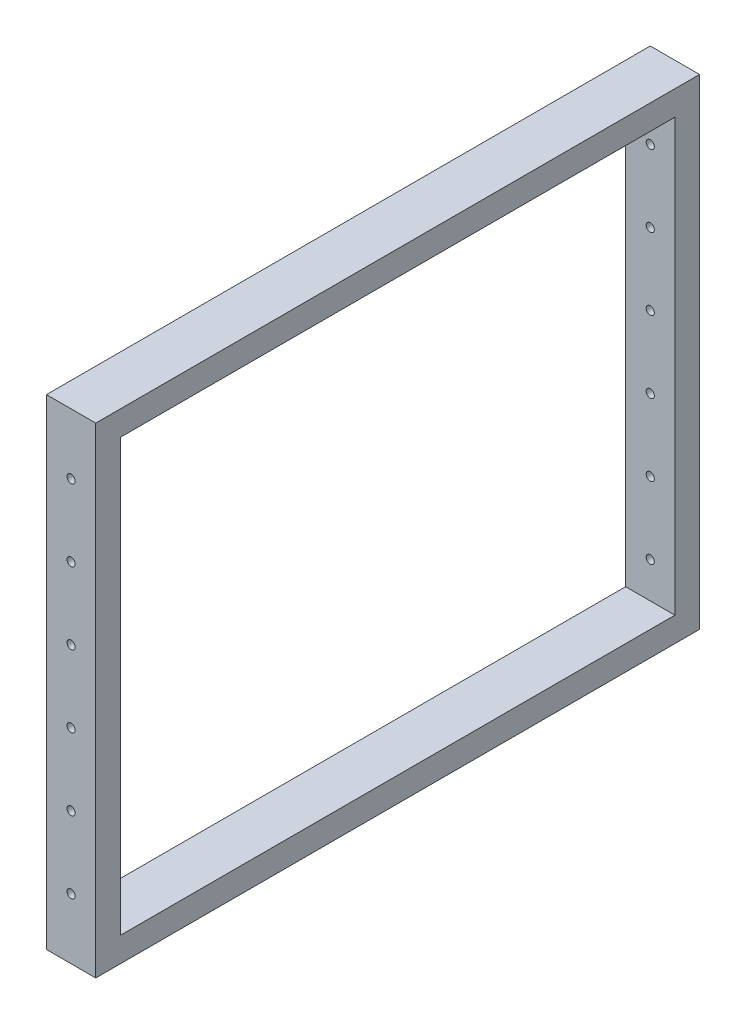
ISO-10303-21;
HEADER;
FILE_DESCRIPTION(('STEP AP214'),'2;1');
FILE_NAME('part.step','',(''),(''),'','','');
FILE_SCHEMA(('AUTOMOTIVE_DESIGN { 1 0 10303 214 1 1 1 1 }'));
ENDSEC;
DATA;
#1=APPLICATION_CONTEXT('core data for automotive mechanical design processes');
#2=APPLICATION_PROTOCOL_DEFINITION('international standard','automotive_design',2000,#1);
#3=PRODUCT_CONTEXT('',#1,'mechanical');
#4=PRODUCT('Part','Part','',(#3));
#5=PRODUCT_RELATED_PRODUCT_CATEGORY('part','',(#4));
#6=PRODUCT_DEFINITION_FORMATION('','',#4);
#7=PRODUCT_DEFINITION_CONTEXT('part definition',#1,'design');
#8=PRODUCT_DEFINITION('design','',#6,#7);
#9=PRODUCT_DEFINITION_SHAPE('','',#8);
#10=(LENGTH_UNIT() NAMED_UNIT(*) SI_UNIT(.MILLI.,.METRE.));
#11=(NAMED_UNIT(*) PLANE_ANGLE_UNIT() SI_UNIT($,.RADIAN.));
#12=(NAMED_UNIT(*) SI_UNIT($,.STERADIAN.) SOLID_ANGLE_UNIT());
#13=UNCERTAINTY_MEASURE_WITH_UNIT(LENGTH_MEASURE(1.E-05),#10,'distance_accuracy_value','');
#14=(GEOMETRIC_REPRESENTATION_CONTEXT(3) GLOBAL_UNCERTAINTY_ASSIGNED_CONTEXT((#13)) GLOBAL_UNIT_ASSIGNED_CONTEXT((#10,
#11,#12)) REPRESENTATION_CONTEXT('',''));
#15=CARTESIAN_POINT('',(0.,0.,0.));
#16=DIRECTION('',(0.,0.,1.));
#17=DIRECTION('',(1.,0.,0.));
#18=AXIS2_PLACEMENT_3D('',#15,#16,#17);
#19=CARTESIAN_POINT('',(40.,0.,0.));
#20=DIRECTION('',(1.,0.,0.));
#21=DIRECTION('',(0.,0.,-1.));
#22=AXIS2_PLACEMENT_3D('',#19,#20,#21);
#23=PLANE('',#22);
#24=DIRECTION('',(0.,-1.,0.));
#25=VECTOR('',#24,1.);
#26=CARTESIAN_POINT('',(40.,0.,490.));
#27=LINE('',#26,#25);
#28=CARTESIAN_POINT('',(40.,390.,490.));
#29=VERTEX_POINT('',#28);
#30=CARTESIAN_POINT('',(40.,0.,490.));
#31=VERTEX_POINT('',#30);
#32=EDGE_CURVE('E131',#29,#31,#27,.T.);
#33=ORIENTED_EDGE('',*,*,#32,.T.);
#34=DIRECTION('',(0.,0.,-1.));
#35=VECTOR('',#34,1.);
#36=CARTESIAN_POINT('',(40.,0.,0.));
#37=LINE('',#36,#35);
#38=CARTESIAN_POINT('',(40.,0.,0.));
#39=VERTEX_POINT('',#38);
#40=EDGE_CURVE('E134',#31,#39,#37,.T.);
#41=ORIENTED_EDGE('',*,*,#40,.T.);
#42=DIRECTION('',(0.,1.,0.));
#43=VECTOR('',#42,1.);
#44=CARTESIAN_POINT('',(40.,0.,0.));
#45=LINE('',#44,#43);
#46=CARTESIAN_POINT('',(40.,390.,0.));
#47=VERTEX_POINT('',#46);
#48=EDGE_CURVE('E137',#39,#47,#45,.T.);
#49=ORIENTED_EDGE('',*,*,#48,.T.);
#50=DIRECTION('',(0.,0.,1.));
#51=VECTOR('',#50,1.);
#52=CARTESIAN_POINT('',(40.,390.,0.));
#53=LINE('',#52,#51);
#54=EDGE_CURVE('E139',#47,#29,#53,.T.);
#55=ORIENTED_EDGE('',*,*,#54,.T.);
#56=EDGE_LOOP('',(#33,#41,#49,#55));
#57=FACE_BOUND('',#56,.T.);
#58=DIRECTION('',(0.,0.,1.));
#59=VECTOR('',#58,1.);
#60=CARTESIAN_POINT('',(40.,20.,0.));
#61=LINE('',#60,#59);
#62=CARTESIAN_POINT('',(40.,20.,20.));
#63=VERTEX_POINT('',#62);
#64=CARTESIAN_POINT('',(40.,20.,470.));
#65=VERTEX_POINT('',#64);
#66=EDGE_CURVE('E122',#63,#65,#61,.T.);
#67=ORIENTED_EDGE('',*,*,#66,.T.);
#68=DIRECTION('',(0.,1.,0.));
#69=VECTOR('',#68,1.);
#70=CARTESIAN_POINT('',(40.,0.,470.));
#71=LINE('',#70,#69);
#72=CARTESIAN_POINT('',(40.,370.,470.));
#73=VERTEX_POINT('',#72);
#74=EDGE_CURVE('E115',#65,#73,#71,.T.);
#75=ORIENTED_EDGE('',*,*,#74,.T.);
#76=DIRECTION('',(0.,0.,-1.));
#77=VECTOR('',#76,1.);
#78=CARTESIAN_POINT('',(40.,370.,0.));
#79=LINE('',#78,#77);
#80=CARTESIAN_POINT('',(40.,370.,20.));
#81=VERTEX_POINT('',#80);
#82=EDGE_CURVE('E104',#73,#81,#79,.T.);
#83=ORIENTED_EDGE('',*,*,#82,.T.);
#84=DIRECTION('',(0.,-1.,0.));
#85=VECTOR('',#84,1.);
#86=CARTESIAN_POINT('',(40.,0.,20.));
#87=LINE('',#86,#85);
#88=EDGE_CURVE('E109',#81,#63,#87,.T.);
#89=ORIENTED_EDGE('',*,*,#88,.T.);
#90=EDGE_LOOP('',(#67,#75,#83,#89));
#91=FACE_BOUND('',#90,.T.);
#92=ADVANCED_FACE('F41',(#57,#91),#23,.T.);
#93=CARTESIAN_POINT('',(0.,0.,0.));
#94=DIRECTION('',(1.,0.,0.));
#95=DIRECTION('',(0.,0.,-1.));
#96=AXIS2_PLACEMENT_3D('',#93,#94,#95);
#97=PLANE('',#96);
#98=DIRECTION('',(0.,-1.,0.));
#99=VECTOR('',#98,1.);
#100=CARTESIAN_POINT('',(0.,0.,490.));
#101=LINE('',#100,#99);
#102=CARTESIAN_POINT('',(0.,390.,490.));
#103=VERTEX_POINT('',#102);
#104=CARTESIAN_POINT('',(0.,0.,490.));
#105=VERTEX_POINT('',#104);
#106=EDGE_CURVE('E123',#103,#105,#101,.T.);
#107=ORIENTED_EDGE('',*,*,#106,.F.);
#108=DIRECTION('',(0.,0.,1.));
#109=VECTOR('',#108,1.);
#110=CARTESIAN_POINT('',(0.,390.,0.));
#111=LINE('',#110,#109);
#112=CARTESIAN_POINT('',(0.,390.,0.));
#113=VERTEX_POINT('',#112);
#114=EDGE_CURVE('E135',#113,#103,#111,.T.);
#115=ORIENTED_EDGE('',*,*,#114,.F.);
#116=DIRECTION('',(0.,1.,0.));
#117=VECTOR('',#116,1.);
#118=CARTESIAN_POINT('',(0.,0.,0.));
#119=LINE('',#118,#117);
#120=CARTESIAN_POINT('',(0.,0.,0.));
#121=VERTEX_POINT('',#120);
#122=EDGE_CURVE('E143',#121,#113,#119,.T.);
#123=ORIENTED_EDGE('',*,*,#122,.F.);
#124=DIRECTION('',(0.,0.,-1.));
#125=VECTOR('',#124,1.);
#126=CARTESIAN_POINT('',(0.,0.,0.));
#127=LINE('',#126,#125);
#128=EDGE_CURVE('E126',#105,#121,#127,.T.);
#129=ORIENTED_EDGE('',*,*,#128,.F.);
#130=EDGE_LOOP('',(#107,#115,#123,#129));
#131=FACE_BOUND('',#130,.T.);
#132=DIRECTION('',(0.,1.,0.));
#133=VECTOR('',#132,1.);
#134=CARTESIAN_POINT('',(0.,0.,470.));
#135=LINE('',#134,#133);
#136=CARTESIAN_POINT('',(0.,20.,470.));
#137=VERTEX_POINT('',#136);
#138=CARTESIAN_POINT('',(0.,370.,470.));
#139=VERTEX_POINT('',#138);
#140=EDGE_CURVE('E11',#137,#139,#135,.T.);
#141=ORIENTED_EDGE('',*,*,#140,.F.);
#142=DIRECTION('',(0.,0.,1.));
#143=VECTOR('',#142,1.);
#144=CARTESIAN_POINT('',(0.,20.,0.));
#145=LINE('',#144,#143);
#146=CARTESIAN_POINT('',(0.,20.,20.));
#147=VERTEX_POINT('',#146);
#148=EDGE_CURVE('E50',#147,#137,#145,.T.);
#149=ORIENTED_EDGE('',*,*,#148,.F.);
#150=DIRECTION('',(0.,-1.,0.));
#151=VECTOR('',#150,1.);
#152=CARTESIAN_POINT('',(0.,0.,20.));
#153=LINE('',#152,#151);
#154=CARTESIAN_POINT('',(0.,370.,20.));
#155=VERTEX_POINT('',#154);
#156=EDGE_CURVE('E159',#155,#147,#153,.T.);
#157=ORIENTED_EDGE('',*,*,#156,.F.);
#158=DIRECTION('',(0.,0.,-1.));
#159=VECTOR('',#158,1.);
#160=CARTESIAN_POINT('',(0.,370.,0.));
#161=LINE('',#160,#159);
#162=EDGE_CURVE('E157',#139,#155,#161,.T.);
#163=ORIENTED_EDGE('',*,*,#162,.F.);
#164=EDGE_LOOP('',(#141,#149,#157,#163));
#165=FACE_BOUND('',#164,.T.);
#166=ADVANCED_FACE('F244',(#131,#165),#97,.F.);
#167=CARTESIAN_POINT('',(40.,0.,490.));
#168=DIRECTION('',(0.,0.,-1.));
#169=DIRECTION('',(-1.,0.,0.));
#170=AXIS2_PLACEMENT_3D('',#167,#168,#169);
#171=PLANE('',#170);
#172=CARTESIAN_POINT('',(20.,340.833333333333,490.));
#173=DIRECTION('',(0.,0.,-1.));
#174=DIRECTION('',(-1.,0.,0.));
#175=AXIS2_PLACEMENT_3D('',#172,#173,#174);
#176=CIRCLE('',#175,3.3);
#177=CARTESIAN_POINT('',(16.7,340.833333333333,490.));
#178=VERTEX_POINT('',#177);
#179=EDGE_CURVE('E184',#178,#178,#176,.F.);
#180=ORIENTED_EDGE('',*,*,#179,.F.);
#181=EDGE_LOOP('',(#180));
#182=FACE_BOUND('',#181,.T.);
#183=CARTESIAN_POINT('',(20.,282.5,490.));
#184=DIRECTION('',(0.,0.,-1.));
#185=DIRECTION('',(-1.,0.,0.));
#186=AXIS2_PLACEMENT_3D('',#183,#184,#185);
#187=CIRCLE('',#186,3.3);
#188=CARTESIAN_POINT('',(16.7,282.5,490.));
#189=VERTEX_POINT('',#188);
#190=EDGE_CURVE('E180',#189,#189,#187,.F.);
#191=ORIENTED_EDGE('',*,*,#190,.F.);
#192=EDGE_LOOP('',(#191));
#193=FACE_BOUND('',#192,.T.);
#194=CARTESIAN_POINT('',(20.,224.166666666667,490.));
#195=DIRECTION('',(0.,0.,-1.));
#196=DIRECTION('',(-1.,0.,0.));
#197=AXIS2_PLACEMENT_3D('',#194,#195,#196);
#198=CIRCLE('',#197,3.3);
#199=CARTESIAN_POINT('',(16.7,224.166666666667,490.));
#200=VERTEX_POINT('',#199);
#201=EDGE_CURVE('E176',#200,#200,#198,.F.);
#202=ORIENTED_EDGE('',*,*,#201,.F.);
#203=EDGE_LOOP('',(#202));
#204=FACE_BOUND('',#203,.T.);
#205=CARTESIAN_POINT('',(20.,165.833333333333,490.));
#206=DIRECTION('',(0.,0.,-1.));
#207=DIRECTION('',(-1.,0.,0.));
#208=AXIS2_PLACEMENT_3D('',#205,#206,#207);
#209=CIRCLE('',#208,3.3);
#210=CARTESIAN_POINT('',(16.7,165.833333333333,490.));
#211=VERTEX_POINT('',#210);
#212=EDGE_CURVE('E171',#211,#211,#209,.F.);
#213=ORIENTED_EDGE('',*,*,#212,.F.);
#214=EDGE_LOOP('',(#213));
#215=FACE_BOUND('',#214,.T.);
#216=CARTESIAN_POINT('',(20.,107.5,490.));
#217=DIRECTION('',(0.,0.,-1.));
#218=DIRECTION('',(-1.,0.,0.));
#219=AXIS2_PLACEMENT_3D('',#216,#217,#218);
#220=CIRCLE('',#219,3.3);
#221=CARTESIAN_POINT('',(16.7,107.5,490.));
#222=VERTEX_POINT('',#221);
#223=EDGE_CURVE('E166',#222,#222,#220,.F.);
#224=ORIENTED_EDGE('',*,*,#223,.F.);
#225=EDGE_LOOP('',(#224));
#226=FACE_BOUND('',#225,.T.);
#227=CARTESIAN_POINT('',(20.,49.1666666666667,490.));
#228=DIRECTION('',(0.,0.,-1.));
#229=DIRECTION('',(-1.,0.,0.));
#230=AXIS2_PLACEMENT_3D('',#227,#228,#229);
#231=CIRCLE('',#230,3.3);
#232=CARTESIAN_POINT('',(16.7,49.1666666666667,490.));
#233=VERTEX_POINT('',#232);
#234=EDGE_CURVE('E119',#233,#233,#231,.F.);
#235=ORIENTED_EDGE('',*,*,#234,.F.);
#236=EDGE_LOOP('',(#235));
#237=FACE_BOUND('',#236,.T.);
#238=ORIENTED_EDGE('',*,*,#106,.T.);
#239=DIRECTION('',(-1.,0.,0.));
#240=VECTOR('',#239,1.);
#241=CARTESIAN_POINT('',(40.,0.,490.));
#242=LINE('',#241,#240);
#243=EDGE_CURVE('E154',#31,#105,#242,.T.);
#244=ORIENTED_EDGE('',*,*,#243,.F.);
#245=ORIENTED_EDGE('',*,*,#32,.F.);
#246=DIRECTION('',(-1.,0.,0.));
#247=VECTOR('',#246,1.);
#248=CARTESIAN_POINT('',(40.,390.,490.));
#249=LINE('',#248,#247);
#250=EDGE_CURVE('E140',#29,#103,#249,.T.);
#251=ORIENTED_EDGE('',*,*,#250,.T.);
#252=EDGE_LOOP('',(#238,#244,#245,#251));
#253=FACE_BOUND('',#252,.T.);
#254=ADVANCED_FACE('F43',(#182,#193,#204,#215,#226,#237,#253),#171,.F.);
#255=CARTESIAN_POINT('',(40.,0.,0.));
#256=DIRECTION('',(0.,1.,0.));
#257=DIRECTION('',(0.,0.,1.));
#258=AXIS2_PLACEMENT_3D('',#255,#256,#257);
#259=PLANE('',#258);
#260=ORIENTED_EDGE('',*,*,#128,.T.);
#261=DIRECTION('',(-1.,0.,0.));
#262=VECTOR('',#261,1.);
#263=CARTESIAN_POINT('',(40.,0.,0.));
#264=LINE('',#263,#262);
#265=EDGE_CURVE('E151',#39,#121,#264,.T.);
#266=ORIENTED_EDGE('',*,*,#265,.F.);
#267=ORIENTED_EDGE('',*,*,#40,.F.);
#268=ORIENTED_EDGE('',*,*,#243,.T.);
#269=EDGE_LOOP('',(#260,#266,#267,#268));
#270=FACE_BOUND('',#269,.T.);
#271=ADVANCED_FACE('F252',(#270),#259,.F.);
#272=CARTESIAN_POINT('',(40.,0.,0.));
#273=DIRECTION('',(0.,0.,1.));
#274=DIRECTION('',(1.,0.,0.));
#275=AXIS2_PLACEMENT_3D('',#272,#273,#274);
#276=PLANE('',#275);
#277=CARTESIAN_POINT('',(20.,340.833333333333,0.));
#278=DIRECTION('',(0.,0.,1.));
#279=DIRECTION('',(1.,0.,0.));
#280=AXIS2_PLACEMENT_3D('',#277,#278,#279);
#281=CIRCLE('',#280,3.3);
#282=CARTESIAN_POINT('',(23.3,340.833333333333,0.));
#283=VERTEX_POINT('',#282);
#284=EDGE_CURVE('E191',#283,#283,#281,.F.);
#285=ORIENTED_EDGE('',*,*,#284,.F.);
#286=EDGE_LOOP('',(#285));
#287=FACE_BOUND('',#286,.T.);
#288=CARTESIAN_POINT('',(20.,282.5,0.));
#289=DIRECTION('',(0.,0.,1.));
#290=DIRECTION('',(1.,0.,0.));
#291=AXIS2_PLACEMENT_3D('',#288,#289,#290);
#292=CIRCLE('',#291,3.3);
#293=CARTESIAN_POINT('',(23.3,282.5,0.));
#294=VERTEX_POINT('',#293);
#295=EDGE_CURVE('E188',#294,#294,#292,.F.);
#296=ORIENTED_EDGE('',*,*,#295,.F.);
#297=EDGE_LOOP('',(#296));
#298=FACE_BOUND('',#297,.T.);
#299=CARTESIAN_POINT('',(20.,224.166666666667,0.));
#300=DIRECTION('',(0.,0.,1.));
#301=DIRECTION('',(1.,0.,0.));
#302=AXIS2_PLACEMENT_3D('',#299,#300,#301);
#303=CIRCLE('',#302,3.3);
#304=CARTESIAN_POINT('',(23.3,224.166666666667,0.));
#305=VERTEX_POINT('',#304);
#306=EDGE_CURVE('E206',#305,#305,#303,.F.);
#307=ORIENTED_EDGE('',*,*,#306,.F.);
#308=EDGE_LOOP('',(#307));
#309=FACE_BOUND('',#308,.T.);
#310=CARTESIAN_POINT('',(20.,165.833333333333,0.));
#311=DIRECTION('',(0.,0.,1.));
#312=DIRECTION('',(1.,0.,0.));
#313=AXIS2_PLACEMENT_3D('',#310,#311,#312);
#314=CIRCLE('',#313,3.3);
#315=CARTESIAN_POINT('',(23.3,165.833333333333,0.));
#316=VERTEX_POINT('',#315);
#317=EDGE_CURVE('E213',#316,#316,#314,.F.);
#318=ORIENTED_EDGE('',*,*,#317,.F.);
#319=EDGE_LOOP('',(#318));
#320=FACE_BOUND('',#319,.T.);
#321=CARTESIAN_POINT('',(20.,107.5,0.));
#322=DIRECTION('',(0.,0.,1.));
#323=DIRECTION('',(1.,0.,0.));
#324=AXIS2_PLACEMENT_3D('',#321,#322,#323);
#325=CIRCLE('',#324,3.3);
#326=CARTESIAN_POINT('',(23.3,107.5,0.));
#327=VERTEX_POINT('',#326);
#328=EDGE_CURVE('E220',#327,#327,#325,.F.);
#329=ORIENTED_EDGE('',*,*,#328,.F.);
#330=EDGE_LOOP('',(#329));
#331=FACE_BOUND('',#330,.T.);
#332=CARTESIAN_POINT('',(20.,49.1666666666667,0.));
#333=DIRECTION('',(0.,0.,1.));
#334=DIRECTION('',(1.,0.,0.));
#335=AXIS2_PLACEMENT_3D('',#332,#333,#334);
#336=CIRCLE('',#335,3.3);
#337=CARTESIAN_POINT('',(23.3,49.1666666666667,0.));
#338=VERTEX_POINT('',#337);
#339=EDGE_CURVE('E227',#338,#338,#336,.F.);
#340=ORIENTED_EDGE('',*,*,#339,.F.);
#341=EDGE_LOOP('',(#340));
#342=FACE_BOUND('',#341,.T.);
#343=ORIENTED_EDGE('',*,*,#122,.T.);
#344=DIRECTION('',(-1.,0.,0.));
#345=VECTOR('',#344,1.);
#346=CARTESIAN_POINT('',(40.,390.,0.));
#347=LINE('',#346,#345);
#348=EDGE_CURVE('E148',#47,#113,#347,.T.);
#349=ORIENTED_EDGE('',*,*,#348,.F.);
#350=ORIENTED_EDGE('',*,*,#48,.F.);
#351=ORIENTED_EDGE('',*,*,#265,.T.);
#352=EDGE_LOOP('',(#343,#349,#350,#351));
#353=FACE_BOUND('',#352,.T.);
#354=ADVANCED_FACE('F262',(#287,#298,#309,#320,#331,#342,#353),#276,.F.);
#355=CARTESIAN_POINT('',(40.,390.,0.));
#356=DIRECTION('',(0.,-1.,0.));
#357=DIRECTION('',(0.,0.,-1.));
#358=AXIS2_PLACEMENT_3D('',#355,#356,#357);
#359=PLANE('',#358);
#360=ORIENTED_EDGE('',*,*,#114,.T.);
#361=ORIENTED_EDGE('',*,*,#250,.F.);
#362=ORIENTED_EDGE('',*,*,#54,.F.);
#363=ORIENTED_EDGE('',*,*,#348,.T.);
#364=EDGE_LOOP('',(#360,#361,#362,#363));
#365=FACE_BOUND('',#364,.T.);
#366=ADVANCED_FACE('F259',(#365),#359,.F.);
#367=CARTESIAN_POINT('',(41.,20.,470.));
#368=DIRECTION('',(0.,0.,-1.));
#369=DIRECTION('',(-1.,0.,0.));
#370=AXIS2_PLACEMENT_3D('',#367,#368,#369);
#371=PLANE('',#370);
#372=CARTESIAN_POINT('',(20.,340.833333333333,470.));
#373=DIRECTION('',(0.,0.,-1.));
#374=DIRECTION('',(-1.,0.,0.));
#375=AXIS2_PLACEMENT_3D('',#372,#373,#374);
#376=CIRCLE('',#375,3.3);
#377=CARTESIAN_POINT('',(16.7,340.833333333333,470.));
#378=VERTEX_POINT('',#377);
#379=EDGE_CURVE('E196',#378,#378,#376,.F.);
#380=ORIENTED_EDGE('',*,*,#379,.T.);
#381=EDGE_LOOP('',(#380));
#382=FACE_BOUND('',#381,.T.);
#383=CARTESIAN_POINT('',(20.,282.5,470.));
#384=DIRECTION('',(0.,0.,-1.));
#385=DIRECTION('',(-1.,0.,0.));
#386=AXIS2_PLACEMENT_3D('',#383,#384,#385);
#387=CIRCLE('',#386,3.3);
#388=CARTESIAN_POINT('',(16.7,282.5,470.));
#389=VERTEX_POINT('',#388);
#390=EDGE_CURVE('E183',#389,#389,#387,.F.);
#391=ORIENTED_EDGE('',*,*,#390,.T.);
#392=EDGE_LOOP('',(#391));
#393=FACE_BOUND('',#392,.T.);
#394=CARTESIAN_POINT('',(20.,224.166666666667,470.));
#395=DIRECTION('',(0.,0.,-1.));
#396=DIRECTION('',(-1.,0.,0.));
#397=AXIS2_PLACEMENT_3D('',#394,#395,#396);
#398=CIRCLE('',#397,3.3);
#399=CARTESIAN_POINT('',(16.7,224.166666666667,470.));
#400=VERTEX_POINT('',#399);
#401=EDGE_CURVE('E179',#400,#400,#398,.F.);
#402=ORIENTED_EDGE('',*,*,#401,.T.);
#403=EDGE_LOOP('',(#402));
#404=FACE_BOUND('',#403,.T.);
#405=CARTESIAN_POINT('',(20.,165.833333333333,470.));
#406=DIRECTION('',(0.,0.,-1.));
#407=DIRECTION('',(-1.,0.,0.));
#408=AXIS2_PLACEMENT_3D('',#405,#406,#407);
#409=CIRCLE('',#408,3.3);
#410=CARTESIAN_POINT('',(16.7,165.833333333333,470.));
#411=VERTEX_POINT('',#410);
#412=EDGE_CURVE('E175',#411,#411,#409,.F.);
#413=ORIENTED_EDGE('',*,*,#412,.T.);
#414=EDGE_LOOP('',(#413));
#415=FACE_BOUND('',#414,.T.);
#416=CARTESIAN_POINT('',(20.,107.5,470.));
#417=DIRECTION('',(0.,0.,-1.));
#418=DIRECTION('',(-1.,0.,0.));
#419=AXIS2_PLACEMENT_3D('',#416,#417,#418);
#420=CIRCLE('',#419,3.3);
#421=CARTESIAN_POINT('',(16.7,107.5,470.));
#422=VERTEX_POINT('',#421);
#423=EDGE_CURVE('E170',#422,#422,#420,.F.);
#424=ORIENTED_EDGE('',*,*,#423,.T.);
#425=EDGE_LOOP('',(#424));
#426=FACE_BOUND('',#425,.T.);
#427=CARTESIAN_POINT('',(20.,49.1666666666667,470.));
#428=DIRECTION('',(0.,0.,-1.));
#429=DIRECTION('',(-1.,0.,0.));
#430=AXIS2_PLACEMENT_3D('',#427,#428,#429);
#431=CIRCLE('',#430,3.3);
#432=CARTESIAN_POINT('',(16.7,49.1666666666667,470.));
#433=VERTEX_POINT('',#432);
#434=EDGE_CURVE('E165',#433,#433,#431,.F.);
#435=ORIENTED_EDGE('',*,*,#434,.T.);
#436=EDGE_LOOP('',(#435));
#437=FACE_BOUND('',#436,.T.);
#438=DIRECTION('',(-1.,0.,0.));
#439=VECTOR('',#438,1.);
#440=CARTESIAN_POINT('',(41.,20.,470.));
#441=LINE('',#440,#439);
#442=EDGE_CURVE('E110',#65,#137,#441,.T.);
#443=ORIENTED_EDGE('',*,*,#442,.T.);
#444=ORIENTED_EDGE('',*,*,#140,.T.);
#445=DIRECTION('',(-1.,0.,0.));
#446=VECTOR('',#445,1.);
#447=CARTESIAN_POINT('',(41.,370.,470.));
#448=LINE('',#447,#446);
#449=EDGE_CURVE('E63',#73,#139,#448,.T.);
#450=ORIENTED_EDGE('',*,*,#449,.F.);
#451=ORIENTED_EDGE('',*,*,#74,.F.);
#452=EDGE_LOOP('',(#443,#444,#450,#451));
#453=FACE_BOUND('',#452,.T.);
#454=ADVANCED_FACE('F114',(#382,#393,#404,#415,#426,#437,#453),#371,.T.);
#455=CARTESIAN_POINT('',(41.,20.,20.));
#456=DIRECTION('',(0.,1.,0.));
#457=DIRECTION('',(0.,0.,1.));
#458=AXIS2_PLACEMENT_3D('',#455,#456,#457);
#459=PLANE('',#458);
#460=DIRECTION('',(-1.,0.,0.));
#461=VECTOR('',#460,1.);
#462=CARTESIAN_POINT('',(41.,20.,20.));
#463=LINE('',#462,#461);
#464=EDGE_CURVE('E233',#63,#147,#463,.T.);
#465=ORIENTED_EDGE('',*,*,#464,.T.);
#466=ORIENTED_EDGE('',*,*,#148,.T.);
#467=ORIENTED_EDGE('',*,*,#442,.F.);
#468=ORIENTED_EDGE('',*,*,#66,.F.);
#469=EDGE_LOOP('',(#465,#466,#467,#468));
#470=FACE_BOUND('',#469,.T.);
#471=ADVANCED_FACE('F242',(#470),#459,.T.);
#472=CARTESIAN_POINT('',(41.,20.,20.));
#473=DIRECTION('',(0.,0.,1.));
#474=DIRECTION('',(1.,0.,0.));
#475=AXIS2_PLACEMENT_3D('',#472,#473,#474);
#476=PLANE('',#475);
#477=CARTESIAN_POINT('',(20.,340.833333333333,20.));
#478=DIRECTION('',(0.,0.,1.));
#479=DIRECTION('',(1.,0.,0.));
#480=AXIS2_PLACEMENT_3D('',#477,#478,#479);
#481=CIRCLE('',#480,3.3);
#482=CARTESIAN_POINT('',(23.3,340.833333333333,20.));
#483=VERTEX_POINT('',#482);
#484=EDGE_CURVE('E45',#483,#483,#481,.F.);
#485=ORIENTED_EDGE('',*,*,#484,.T.);
#486=EDGE_LOOP('',(#485));
#487=FACE_BOUND('',#486,.T.);
#488=CARTESIAN_POINT('',(20.,282.5,20.));
#489=DIRECTION('',(0.,0.,1.));
#490=DIRECTION('',(1.,0.,0.));
#491=AXIS2_PLACEMENT_3D('',#488,#489,#490);
#492=CIRCLE('',#491,3.3);
#493=CARTESIAN_POINT('',(23.3,282.5,20.));
#494=VERTEX_POINT('',#493);
#495=EDGE_CURVE('E181',#494,#494,#492,.F.);
#496=ORIENTED_EDGE('',*,*,#495,.T.);
#497=EDGE_LOOP('',(#496));
#498=FACE_BOUND('',#497,.T.);
#499=CARTESIAN_POINT('',(20.,224.166666666667,20.));
#500=DIRECTION('',(0.,0.,1.));
#501=DIRECTION('',(1.,0.,0.));
#502=AXIS2_PLACEMENT_3D('',#499,#500,#501);
#503=CIRCLE('',#502,3.3);
#504=CARTESIAN_POINT('',(23.3,224.166666666667,20.));
#505=VERTEX_POINT('',#504);
#506=EDGE_CURVE('E177',#505,#505,#503,.F.);
#507=ORIENTED_EDGE('',*,*,#506,.T.);
#508=EDGE_LOOP('',(#507));
#509=FACE_BOUND('',#508,.T.);
#510=CARTESIAN_POINT('',(20.,165.833333333333,20.));
#511=DIRECTION('',(0.,0.,1.));
#512=DIRECTION('',(1.,0.,0.));
#513=AXIS2_PLACEMENT_3D('',#510,#511,#512);
#514=CIRCLE('',#513,3.3);
#515=CARTESIAN_POINT('',(23.3,165.833333333333,20.));
#516=VERTEX_POINT('',#515);
#517=EDGE_CURVE('E172',#516,#516,#514,.F.);
#518=ORIENTED_EDGE('',*,*,#517,.T.);
#519=EDGE_LOOP('',(#518));
#520=FACE_BOUND('',#519,.T.);
#521=CARTESIAN_POINT('',(20.,107.5,20.));
#522=DIRECTION('',(0.,0.,1.));
#523=DIRECTION('',(1.,0.,0.));
#524=AXIS2_PLACEMENT_3D('',#521,#522,#523);
#525=CIRCLE('',#524,3.3);
#526=CARTESIAN_POINT('',(23.3,107.5,20.));
#527=VERTEX_POINT('',#526);
#528=EDGE_CURVE('E167',#527,#527,#525,.F.);
#529=ORIENTED_EDGE('',*,*,#528,.T.);
#530=EDGE_LOOP('',(#529));
#531=FACE_BOUND('',#530,.T.);
#532=CARTESIAN_POINT('',(20.,49.1666666666667,20.));
#533=DIRECTION('',(0.,0.,1.));
#534=DIRECTION('',(1.,0.,0.));
#535=AXIS2_PLACEMENT_3D('',#532,#533,#534);
#536=CIRCLE('',#535,3.3);
#537=CARTESIAN_POINT('',(23.3,49.1666666666667,20.));
#538=VERTEX_POINT('',#537);
#539=EDGE_CURVE('E162',#538,#538,#536,.F.);
#540=ORIENTED_EDGE('',*,*,#539,.T.);
#541=EDGE_LOOP('',(#540));
#542=FACE_BOUND('',#541,.T.);
#543=DIRECTION('',(-1.,0.,0.));
#544=VECTOR('',#543,1.);
#545=CARTESIAN_POINT('',(41.,370.,20.));
#546=LINE('',#545,#544);
#547=EDGE_CURVE('E58',#81,#155,#546,.T.);
#548=ORIENTED_EDGE('',*,*,#547,.T.);
#549=ORIENTED_EDGE('',*,*,#156,.T.);
#550=ORIENTED_EDGE('',*,*,#464,.F.);
#551=ORIENTED_EDGE('',*,*,#88,.F.);
#552=EDGE_LOOP('',(#548,#549,#550,#551));
#553=FACE_BOUND('',#552,.T.);
#554=ADVANCED_FACE('F238',(#487,#498,#509,#520,#531,#542,#553),#476,.T.);
#555=CARTESIAN_POINT('',(41.,370.,20.));
#556=DIRECTION('',(0.,-1.,0.));
#557=DIRECTION('',(0.,0.,-1.));
#558=AXIS2_PLACEMENT_3D('',#555,#556,#557);
#559=PLANE('',#558);
#560=ORIENTED_EDGE('',*,*,#449,.T.);
#561=ORIENTED_EDGE('',*,*,#162,.T.);
#562=ORIENTED_EDGE('',*,*,#547,.F.);
#563=ORIENTED_EDGE('',*,*,#82,.F.);
#564=EDGE_LOOP('',(#560,#561,#562,#563));
#565=FACE_BOUND('',#564,.T.);
#566=ADVANCED_FACE('F105',(#565),#559,.T.);
#567=CARTESIAN_POINT('',(20.,49.1666666666667,491.));
#568=DIRECTION('',(0.,0.,-1.));
#569=DIRECTION('',(-1.,0.,0.));
#570=AXIS2_PLACEMENT_3D('',#567,#568,#569);
#571=CYLINDRICAL_SURFACE('',#570,3.3);
#572=ORIENTED_EDGE('',*,*,#539,.F.);
#573=EDGE_LOOP('',(#572));
#574=FACE_BOUND('',#573,.T.);
#575=ORIENTED_EDGE('',*,*,#339,.T.);
#576=EDGE_LOOP('',(#575));
#577=FACE_BOUND('',#576,.T.);
#578=ADVANCED_FACE('F304',(#574,#577),#571,.F.);
#579=ORIENTED_EDGE('',*,*,#434,.F.);
#580=EDGE_LOOP('',(#579));
#581=FACE_BOUND('',#580,.T.);
#582=ORIENTED_EDGE('',*,*,#234,.T.);
#583=EDGE_LOOP('',(#582));
#584=FACE_BOUND('',#583,.T.);
#585=ADVANCED_FACE('F310',(#581,#584),#571,.F.);
#586=CARTESIAN_POINT('',(20.,107.5,491.));
#587=DIRECTION('',(0.,0.,-1.));
#588=DIRECTION('',(-1.,0.,0.));
#589=AXIS2_PLACEMENT_3D('',#586,#587,#588);
#590=CYLINDRICAL_SURFACE('',#589,3.3);
#591=ORIENTED_EDGE('',*,*,#528,.F.);
#592=EDGE_LOOP('',(#591));
#593=FACE_BOUND('',#592,.T.);
#594=ORIENTED_EDGE('',*,*,#328,.T.);
#595=EDGE_LOOP('',(#594));
#596=FACE_BOUND('',#595,.T.);
#597=ADVANCED_FACE('F313',(#593,#596),#590,.F.);
#598=ORIENTED_EDGE('',*,*,#423,.F.);
#599=EDGE_LOOP('',(#598));
#600=FACE_BOUND('',#599,.T.);
#601=ORIENTED_EDGE('',*,*,#223,.T.);
#602=EDGE_LOOP('',(#601));
#603=FACE_BOUND('',#602,.T.);
#604=ADVANCED_FACE('F320',(#600,#603),#590,.F.);
#605=CARTESIAN_POINT('',(20.,165.833333333333,491.));
#606=DIRECTION('',(0.,0.,-1.));
#607=DIRECTION('',(-1.,0.,0.));
#608=AXIS2_PLACEMENT_3D('',#605,#606,#607);
#609=CYLINDRICAL_SURFACE('',#608,3.3);
#610=ORIENTED_EDGE('',*,*,#517,.F.);
#611=EDGE_LOOP('',(#610));
#612=FACE_BOUND('',#611,.T.);
#613=ORIENTED_EDGE('',*,*,#317,.T.);
#614=EDGE_LOOP('',(#613));
#615=FACE_BOUND('',#614,.T.);
#616=ADVANCED_FACE('F325',(#612,#615),#609,.F.);
#617=ORIENTED_EDGE('',*,*,#412,.F.);
#618=EDGE_LOOP('',(#617));
#619=FACE_BOUND('',#618,.T.);
#620=ORIENTED_EDGE('',*,*,#212,.T.);
#621=EDGE_LOOP('',(#620));
#622=FACE_BOUND('',#621,.T.);
#623=ADVANCED_FACE('F350',(#619,#622),#609,.F.);
#624=CARTESIAN_POINT('',(20.,224.166666666667,491.));
#625=DIRECTION('',(0.,0.,-1.));
#626=DIRECTION('',(-1.,0.,0.));
#627=AXIS2_PLACEMENT_3D('',#624,#625,#626);
#628=CYLINDRICAL_SURFACE('',#627,3.3);
#629=ORIENTED_EDGE('',*,*,#506,.F.);
#630=EDGE_LOOP('',(#629));
#631=FACE_BOUND('',#630,.T.);
#632=ORIENTED_EDGE('',*,*,#306,.T.);
#633=EDGE_LOOP('',(#632));
#634=FACE_BOUND('',#633,.T.);
#635=ADVANCED_FACE('F359',(#631,#634),#628,.F.);
#636=ORIENTED_EDGE('',*,*,#401,.F.);
#637=EDGE_LOOP('',(#636));
#638=FACE_BOUND('',#637,.T.);
#639=ORIENTED_EDGE('',*,*,#201,.T.);
#640=EDGE_LOOP('',(#639));
#641=FACE_BOUND('',#640,.T.);
#642=ADVANCED_FACE('F365',(#638,#641),#628,.F.);
#643=CARTESIAN_POINT('',(20.,282.5,491.));
#644=DIRECTION('',(0.,0.,-1.));
#645=DIRECTION('',(-1.,0.,0.));
#646=AXIS2_PLACEMENT_3D('',#643,#644,#645);
#647=CYLINDRICAL_SURFACE('',#646,3.3);
#648=ORIENTED_EDGE('',*,*,#495,.F.);
#649=EDGE_LOOP('',(#648));
#650=FACE_BOUND('',#649,.T.);
#651=ORIENTED_EDGE('',*,*,#295,.T.);
#652=EDGE_LOOP('',(#651));
#653=FACE_BOUND('',#652,.T.);
#654=ADVANCED_FACE('F370',(#650,#653),#647,.F.);
#655=ORIENTED_EDGE('',*,*,#390,.F.);
#656=EDGE_LOOP('',(#655));
#657=FACE_BOUND('',#656,.T.);
#658=ORIENTED_EDGE('',*,*,#190,.T.);
#659=EDGE_LOOP('',(#658));
#660=FACE_BOUND('',#659,.T.);
#661=ADVANCED_FACE('F410',(#657,#660),#647,.F.);
#662=CARTESIAN_POINT('',(20.,340.833333333333,491.));
#663=DIRECTION('',(0.,0.,-1.));
#664=DIRECTION('',(-1.,0.,0.));
#665=AXIS2_PLACEMENT_3D('',#662,#663,#664);
#666=CYLINDRICAL_SURFACE('',#665,3.3);
#667=ORIENTED_EDGE('',*,*,#484,.F.);
#668=EDGE_LOOP('',(#667));
#669=FACE_BOUND('',#668,.T.);
#670=ORIENTED_EDGE('',*,*,#284,.T.);
#671=EDGE_LOOP('',(#670));
#672=FACE_BOUND('',#671,.T.);
#673=ADVANCED_FACE('F419',(#669,#672),#666,.F.);
#674=ORIENTED_EDGE('',*,*,#379,.F.);
#675=EDGE_LOOP('',(#674));
#676=FACE_BOUND('',#675,.T.);
#677=ORIENTED_EDGE('',*,*,#179,.T.);
#678=EDGE_LOOP('',(#677));
#679=FACE_BOUND('',#678,.T.);
#680=ADVANCED_FACE('F425',(#676,#679),#666,.F.);
#681=CLOSED_SHELL('',(#92,#166,#254,#271,#354,#366,#454,#471,#554,#566,#578,#585,#597,#604,#616,
#623,#635,#642,#654,#661,#673,#680));
#682=MANIFOLD_SOLID_BREP('B2',#681);
#683=ADVANCED_BREP_SHAPE_REPRESENTATION('',(#18,#682),#14);
#684=SHAPE_DEFINITION_REPRESENTATION(#9,#683);
ENDSEC;
END-ISO-10303-21;
